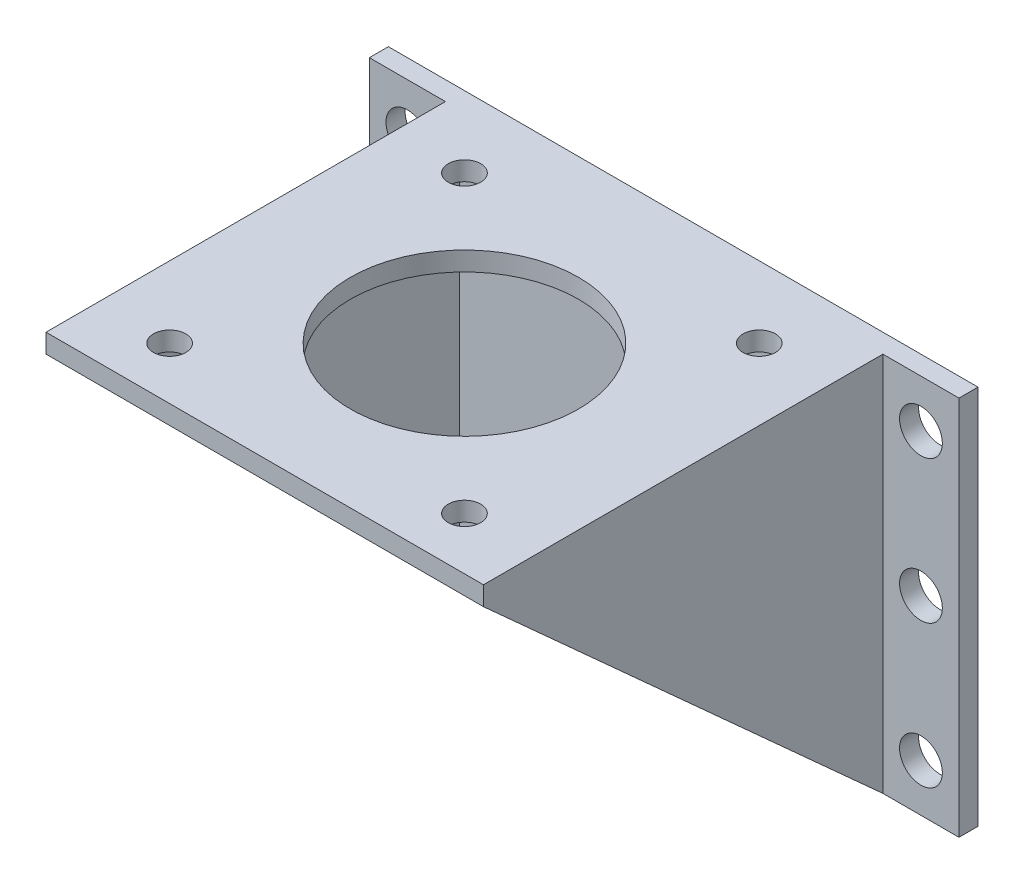
ISO-10303-21;
HEADER;
FILE_DESCRIPTION(('STEP AP214'),'2;1');
FILE_NAME('part.step','',(''),(''),'','','');
FILE_SCHEMA(('AUTOMOTIVE_DESIGN { 1 0 10303 214 1 1 1 1 }'));
ENDSEC;
DATA;
#1=APPLICATION_CONTEXT('core data for automotive mechanical design processes');
#2=APPLICATION_PROTOCOL_DEFINITION('international standard','automotive_design',2000,#1);
#3=PRODUCT_CONTEXT('',#1,'mechanical');
#4=PRODUCT('Part','Part','',(#3));
#5=PRODUCT_RELATED_PRODUCT_CATEGORY('part','',(#4));
#6=PRODUCT_DEFINITION_FORMATION('','',#4);
#7=PRODUCT_DEFINITION_CONTEXT('part definition',#1,'design');
#8=PRODUCT_DEFINITION('design','',#6,#7);
#9=PRODUCT_DEFINITION_SHAPE('','',#8);
#10=(LENGTH_UNIT() NAMED_UNIT(*) SI_UNIT(.MILLI.,.METRE.));
#11=(NAMED_UNIT(*) PLANE_ANGLE_UNIT() SI_UNIT($,.RADIAN.));
#12=(NAMED_UNIT(*) SI_UNIT($,.STERADIAN.) SOLID_ANGLE_UNIT());
#13=UNCERTAINTY_MEASURE_WITH_UNIT(LENGTH_MEASURE(1.E-05),#10,'distance_accuracy_value','');
#14=(GEOMETRIC_REPRESENTATION_CONTEXT(3) GLOBAL_UNCERTAINTY_ASSIGNED_CONTEXT((#13)) GLOBAL_UNIT_ASSIGNED_CONTEXT((#10,
#11,#12)) REPRESENTATION_CONTEXT('',''));
#15=CARTESIAN_POINT('',(0.,0.,0.));
#16=DIRECTION('',(0.,0.,1.));
#17=DIRECTION('',(1.,0.,0.));
#18=AXIS2_PLACEMENT_3D('',#15,#16,#17);
#19=CARTESIAN_POINT('',(0.,0.,2.));
#20=DIRECTION('',(0.,0.,1.));
#21=DIRECTION('',(1.,0.,0.));
#22=AXIS2_PLACEMENT_3D('',#19,#20,#21);
#23=PLANE('',#22);
#24=CARTESIAN_POINT('',(27.,0.,2.));
#25=DIRECTION('',(0.,0.,-1.));
#26=DIRECTION('',(1.,0.,0.));
#27=AXIS2_PLACEMENT_3D('',#24,#25,#26);
#28=CIRCLE('',#27,2.25);
#29=CARTESIAN_POINT('',(29.25,0.,2.));
#30=VERTEX_POINT('',#29);
#31=EDGE_CURVE('E11',#30,#30,#28,.T.);
#32=ORIENTED_EDGE('',*,*,#31,.T.);
#33=EDGE_LOOP('',(#32));
#34=FACE_BOUND('',#33,.T.);
#35=CARTESIAN_POINT('',(27.,-15.,2.));
#36=DIRECTION('',(0.,0.,-1.));
#37=DIRECTION('',(1.,0.,0.));
#38=AXIS2_PLACEMENT_3D('',#35,#36,#37);
#39=CIRCLE('',#38,2.25);
#40=CARTESIAN_POINT('',(29.25,-15.,2.));
#41=VERTEX_POINT('',#40);
#42=EDGE_CURVE('E23',#41,#41,#39,.T.);
#43=ORIENTED_EDGE('',*,*,#42,.T.);
#44=EDGE_LOOP('',(#43));
#45=FACE_BOUND('',#44,.T.);
#46=CARTESIAN_POINT('',(27.,15.,2.));
#47=DIRECTION('',(0.,0.,-1.));
#48=DIRECTION('',(1.,0.,0.));
#49=AXIS2_PLACEMENT_3D('',#46,#47,#48);
#50=CIRCLE('',#49,2.25);
#51=CARTESIAN_POINT('',(29.25,15.,2.));
#52=VERTEX_POINT('',#51);
#53=EDGE_CURVE('E252',#52,#52,#50,.T.);
#54=ORIENTED_EDGE('',*,*,#53,.T.);
#55=EDGE_LOOP('',(#54));
#56=FACE_BOUND('',#55,.T.);
#57=DIRECTION('',(0.,-1.,0.));
#58=VECTOR('',#57,1.);
#59=CARTESIAN_POINT('',(23.,19.,2.));
#60=LINE('',#59,#58);
#61=CARTESIAN_POINT('',(23.,20.,2.));
#62=VERTEX_POINT('',#61);
#63=CARTESIAN_POINT('',(23.,-20.,2.));
#64=VERTEX_POINT('',#63);
#65=EDGE_CURVE('E30',#62,#64,#60,.T.);
#66=ORIENTED_EDGE('',*,*,#65,.T.);
#67=DIRECTION('',(-1.,0.,0.));
#68=VECTOR('',#67,1.);
#69=CARTESIAN_POINT('',(0.,-20.,2.));
#70=LINE('',#69,#68);
#71=CARTESIAN_POINT('',(31.,-20.,2.));
#72=VERTEX_POINT('',#71);
#73=EDGE_CURVE('E34',#72,#64,#70,.T.);
#74=ORIENTED_EDGE('',*,*,#73,.F.);
#75=DIRECTION('',(0.,-1.,0.));
#76=VECTOR('',#75,1.);
#77=CARTESIAN_POINT('',(31.,0.,2.));
#78=LINE('',#77,#76);
#79=CARTESIAN_POINT('',(31.,20.,2.));
#80=VERTEX_POINT('',#79);
#81=EDGE_CURVE('E247',#80,#72,#78,.T.);
#82=ORIENTED_EDGE('',*,*,#81,.F.);
#83=DIRECTION('',(-1.,0.,0.));
#84=VECTOR('',#83,1.);
#85=CARTESIAN_POINT('',(0.,20.,2.));
#86=LINE('',#85,#84);
#87=EDGE_CURVE('E245',#80,#62,#86,.T.);
#88=ORIENTED_EDGE('',*,*,#87,.T.);
#89=EDGE_LOOP('',(#66,#74,#82,#88));
#90=FACE_BOUND('',#89,.T.);
#91=ADVANCED_FACE('F16',(#34,#45,#56,#90),#23,.T.);
#92=CARTESIAN_POINT('',(0.,18.,2.));
#93=DIRECTION('',(0.,-1.,0.));
#94=DIRECTION('',(0.,0.,-1.));
#95=AXIS2_PLACEMENT_3D('',#92,#93,#94);
#96=PLANE('',#95);
#97=CARTESIAN_POINT('',(15.5,18.,7.5));
#98=DIRECTION('',(0.,1.,0.));
#99=DIRECTION('',(0.,0.,1.));
#100=AXIS2_PLACEMENT_3D('',#97,#98,#99);
#101=CIRCLE('',#100,1.7);
#102=CARTESIAN_POINT('',(15.5,18.,9.2));
#103=VERTEX_POINT('',#102);
#104=EDGE_CURVE('E242',#103,#103,#101,.F.);
#105=ORIENTED_EDGE('',*,*,#104,.F.);
#106=EDGE_LOOP('',(#105));
#107=FACE_BOUND('',#106,.T.);
#108=CARTESIAN_POINT('',(15.5,18.,38.5));
#109=DIRECTION('',(0.,1.,0.));
#110=DIRECTION('',(0.,0.,1.));
#111=AXIS2_PLACEMENT_3D('',#108,#109,#110);
#112=CIRCLE('',#111,1.7);
#113=CARTESIAN_POINT('',(15.5,18.,40.2));
#114=VERTEX_POINT('',#113);
#115=EDGE_CURVE('E239',#114,#114,#112,.F.);
#116=ORIENTED_EDGE('',*,*,#115,.F.);
#117=EDGE_LOOP('',(#116));
#118=FACE_BOUND('',#117,.T.);
#119=CARTESIAN_POINT('',(-15.5,18.,7.5));
#120=DIRECTION('',(0.,1.,0.));
#121=DIRECTION('',(0.,0.,1.));
#122=AXIS2_PLACEMENT_3D('',#119,#120,#121);
#123=CIRCLE('',#122,1.7);
#124=CARTESIAN_POINT('',(-15.5,18.,9.2));
#125=VERTEX_POINT('',#124);
#126=EDGE_CURVE('E236',#125,#125,#123,.F.);
#127=ORIENTED_EDGE('',*,*,#126,.F.);
#128=EDGE_LOOP('',(#127));
#129=FACE_BOUND('',#128,.T.);
#130=CARTESIAN_POINT('',(-15.5,18.,38.5));
#131=DIRECTION('',(0.,1.,0.));
#132=DIRECTION('',(0.,0.,1.));
#133=AXIS2_PLACEMENT_3D('',#130,#131,#132);
#134=CIRCLE('',#133,1.7);
#135=CARTESIAN_POINT('',(-15.5,18.,40.2));
#136=VERTEX_POINT('',#135);
#137=EDGE_CURVE('E233',#136,#136,#134,.F.);
#138=ORIENTED_EDGE('',*,*,#137,.F.);
#139=EDGE_LOOP('',(#138));
#140=FACE_BOUND('',#139,.T.);
#141=CARTESIAN_POINT('',(0.,18.,23.));
#142=DIRECTION('',(0.,1.,0.));
#143=DIRECTION('',(0.,0.,1.));
#144=AXIS2_PLACEMENT_3D('',#141,#142,#143);
#145=CIRCLE('',#144,12.);
#146=CARTESIAN_POINT('',(0.,18.,35.));
#147=VERTEX_POINT('',#146);
#148=EDGE_CURVE('E230',#147,#147,#145,.F.);
#149=ORIENTED_EDGE('',*,*,#148,.F.);
#150=EDGE_LOOP('',(#149));
#151=FACE_BOUND('',#150,.T.);
#152=DIRECTION('',(1.,0.,0.));
#153=VECTOR('',#152,1.);
#154=CARTESIAN_POINT('',(0.,18.,2.));
#155=LINE('',#154,#153);
#156=CARTESIAN_POINT('',(-21.5,18.,2.));
#157=VERTEX_POINT('',#156);
#158=CARTESIAN_POINT('',(21.5,18.,2.));
#159=VERTEX_POINT('',#158);
#160=EDGE_CURVE('E228',#157,#159,#155,.T.);
#161=ORIENTED_EDGE('',*,*,#160,.T.);
#162=DIRECTION('',(0.,0.,1.));
#163=VECTOR('',#162,1.);
#164=CARTESIAN_POINT('',(21.5,18.,23.));
#165=LINE('',#164,#163);
#166=CARTESIAN_POINT('',(21.5,18.,44.));
#167=VERTEX_POINT('',#166);
#168=EDGE_CURVE('E226',#159,#167,#165,.T.);
#169=ORIENTED_EDGE('',*,*,#168,.T.);
#170=DIRECTION('',(1.,0.,0.));
#171=VECTOR('',#170,1.);
#172=CARTESIAN_POINT('',(0.,18.,44.));
#173=LINE('',#172,#171);
#174=CARTESIAN_POINT('',(-21.5,18.,44.));
#175=VERTEX_POINT('',#174);
#176=EDGE_CURVE('E114',#175,#167,#173,.T.);
#177=ORIENTED_EDGE('',*,*,#176,.F.);
#178=DIRECTION('',(0.,0.,-1.));
#179=VECTOR('',#178,1.);
#180=CARTESIAN_POINT('',(-21.5,18.,23.));
#181=LINE('',#180,#179);
#182=EDGE_CURVE('E223',#175,#157,#181,.T.);
#183=ORIENTED_EDGE('',*,*,#182,.T.);
#184=EDGE_LOOP('',(#161,#169,#177,#183));
#185=FACE_BOUND('',#184,.T.);
#186=ADVANCED_FACE('F290',(#107,#118,#129,#140,#151,#185),#96,.T.);
#187=CARTESIAN_POINT('',(0.,0.,2.));
#188=DIRECTION('',(0.,0.,1.));
#189=DIRECTION('',(1.,0.,0.));
#190=AXIS2_PLACEMENT_3D('',#187,#188,#189);
#191=PLANE('',#190);
#192=DIRECTION('',(0.,-1.,0.));
#193=VECTOR('',#192,1.);
#194=CARTESIAN_POINT('',(21.5,19.,2.));
#195=LINE('',#194,#193);
#196=CARTESIAN_POINT('',(21.5,-20.,2.));
#197=VERTEX_POINT('',#196);
#198=EDGE_CURVE('E220',#159,#197,#195,.T.);
#199=ORIENTED_EDGE('',*,*,#198,.F.);
#200=ORIENTED_EDGE('',*,*,#160,.F.);
#201=DIRECTION('',(0.,-1.,0.));
#202=VECTOR('',#201,1.);
#203=CARTESIAN_POINT('',(-21.5,19.,2.));
#204=LINE('',#203,#202);
#205=CARTESIAN_POINT('',(-21.5,-20.,2.));
#206=VERTEX_POINT('',#205);
#207=EDGE_CURVE('E218',#157,#206,#204,.T.);
#208=ORIENTED_EDGE('',*,*,#207,.T.);
#209=DIRECTION('',(-1.,0.,0.));
#210=VECTOR('',#209,1.);
#211=CARTESIAN_POINT('',(0.,-20.,2.));
#212=LINE('',#211,#210);
#213=EDGE_CURVE('E215',#197,#206,#212,.T.);
#214=ORIENTED_EDGE('',*,*,#213,.F.);
#215=EDGE_LOOP('',(#199,#200,#208,#214));
#216=FACE_BOUND('',#215,.T.);
#217=ADVANCED_FACE('F296',(#216),#191,.T.);
#218=CARTESIAN_POINT('',(0.,-20.,2.));
#219=DIRECTION('',(0.,-1.,0.));
#220=DIRECTION('',(0.,0.,-1.));
#221=AXIS2_PLACEMENT_3D('',#218,#219,#220);
#222=PLANE('',#221);
#223=ORIENTED_EDGE('',*,*,#73,.T.);
#224=DIRECTION('',(1.,0.,0.));
#225=VECTOR('',#224,1.);
#226=CARTESIAN_POINT('',(21.5,-20.,2.));
#227=LINE('',#226,#225);
#228=EDGE_CURVE('E123',#197,#64,#227,.T.);
#229=ORIENTED_EDGE('',*,*,#228,.F.);
#230=ORIENTED_EDGE('',*,*,#213,.T.);
#231=DIRECTION('',(-1.,0.,0.));
#232=VECTOR('',#231,1.);
#233=CARTESIAN_POINT('',(-21.5,-20.,2.));
#234=LINE('',#233,#232);
#235=CARTESIAN_POINT('',(-23.,-20.,2.));
#236=VERTEX_POINT('',#235);
#237=EDGE_CURVE('E212',#206,#236,#234,.T.);
#238=ORIENTED_EDGE('',*,*,#237,.T.);
#239=DIRECTION('',(-1.,0.,0.));
#240=VECTOR('',#239,1.);
#241=CARTESIAN_POINT('',(0.,-20.,2.));
#242=LINE('',#241,#240);
#243=CARTESIAN_POINT('',(-31.,-20.,2.));
#244=VERTEX_POINT('',#243);
#245=EDGE_CURVE('E210',#236,#244,#242,.T.);
#246=ORIENTED_EDGE('',*,*,#245,.T.);
#247=DIRECTION('',(0.,0.,-1.));
#248=VECTOR('',#247,1.);
#249=CARTESIAN_POINT('',(-31.,-20.,2.));
#250=LINE('',#249,#248);
#251=CARTESIAN_POINT('',(-31.,-20.,0.));
#252=VERTEX_POINT('',#251);
#253=EDGE_CURVE('E208',#244,#252,#250,.T.);
#254=ORIENTED_EDGE('',*,*,#253,.T.);
#255=DIRECTION('',(-1.,0.,0.));
#256=VECTOR('',#255,1.);
#257=CARTESIAN_POINT('',(0.,-20.,0.));
#258=LINE('',#257,#256);
#259=CARTESIAN_POINT('',(31.,-20.,0.));
#260=VERTEX_POINT('',#259);
#261=EDGE_CURVE('E205',#260,#252,#258,.T.);
#262=ORIENTED_EDGE('',*,*,#261,.F.);
#263=DIRECTION('',(0.,0.,-1.));
#264=VECTOR('',#263,1.);
#265=CARTESIAN_POINT('',(31.,-20.,2.));
#266=LINE('',#265,#264);
#267=EDGE_CURVE('E202',#72,#260,#266,.T.);
#268=ORIENTED_EDGE('',*,*,#267,.F.);
#269=EDGE_LOOP('',(#223,#229,#230,#238,#246,#254,#262,#268));
#270=FACE_BOUND('',#269,.T.);
#271=ADVANCED_FACE('F328',(#270),#222,.T.);
#272=CARTESIAN_POINT('',(0.,0.,2.));
#273=DIRECTION('',(0.,0.,1.));
#274=DIRECTION('',(1.,0.,0.));
#275=AXIS2_PLACEMENT_3D('',#272,#273,#274);
#276=PLANE('',#275);
#277=ORIENTED_EDGE('',*,*,#245,.F.);
#278=DIRECTION('',(0.,-1.,0.));
#279=VECTOR('',#278,1.);
#280=CARTESIAN_POINT('',(-23.,19.,2.));
#281=LINE('',#280,#279);
#282=CARTESIAN_POINT('',(-23.,20.,2.));
#283=VERTEX_POINT('',#282);
#284=EDGE_CURVE('E199',#283,#236,#281,.T.);
#285=ORIENTED_EDGE('',*,*,#284,.F.);
#286=DIRECTION('',(-1.,0.,0.));
#287=VECTOR('',#286,1.);
#288=CARTESIAN_POINT('',(0.,20.,2.));
#289=LINE('',#288,#287);
#290=CARTESIAN_POINT('',(-31.,20.,2.));
#291=VERTEX_POINT('',#290);
#292=EDGE_CURVE('E197',#283,#291,#289,.T.);
#293=ORIENTED_EDGE('',*,*,#292,.T.);
#294=DIRECTION('',(0.,-1.,0.));
#295=VECTOR('',#294,1.);
#296=CARTESIAN_POINT('',(-31.,0.,2.));
#297=LINE('',#296,#295);
#298=EDGE_CURVE('E194',#291,#244,#297,.T.);
#299=ORIENTED_EDGE('',*,*,#298,.T.);
#300=EDGE_LOOP('',(#277,#285,#293,#299));
#301=FACE_BOUND('',#300,.T.);
#302=CARTESIAN_POINT('',(-27.,15.,2.));
#303=DIRECTION('',(0.,0.,1.));
#304=DIRECTION('',(1.,0.,0.));
#305=AXIS2_PLACEMENT_3D('',#302,#303,#304);
#306=CIRCLE('',#305,2.25);
#307=CARTESIAN_POINT('',(-24.75,15.,2.));
#308=VERTEX_POINT('',#307);
#309=EDGE_CURVE('E191',#308,#308,#306,.T.);
#310=ORIENTED_EDGE('',*,*,#309,.F.);
#311=EDGE_LOOP('',(#310));
#312=FACE_BOUND('',#311,.T.);
#313=CARTESIAN_POINT('',(-27.,0.,2.));
#314=DIRECTION('',(0.,0.,1.));
#315=DIRECTION('',(1.,0.,0.));
#316=AXIS2_PLACEMENT_3D('',#313,#314,#315);
#317=CIRCLE('',#316,2.25);
#318=CARTESIAN_POINT('',(-24.75,0.,2.));
#319=VERTEX_POINT('',#318);
#320=EDGE_CURVE('E188',#319,#319,#317,.T.);
#321=ORIENTED_EDGE('',*,*,#320,.F.);
#322=EDGE_LOOP('',(#321));
#323=FACE_BOUND('',#322,.T.);
#324=CARTESIAN_POINT('',(-27.,-15.,2.));
#325=DIRECTION('',(0.,0.,1.));
#326=DIRECTION('',(1.,0.,0.));
#327=AXIS2_PLACEMENT_3D('',#324,#325,#326);
#328=CIRCLE('',#327,2.25);
#329=CARTESIAN_POINT('',(-24.75,-15.,2.));
#330=VERTEX_POINT('',#329);
#331=EDGE_CURVE('E185',#330,#330,#328,.T.);
#332=ORIENTED_EDGE('',*,*,#331,.F.);
#333=EDGE_LOOP('',(#332));
#334=FACE_BOUND('',#333,.T.);
#335=ADVANCED_FACE('F324',(#301,#312,#323,#334),#276,.T.);
#336=CARTESIAN_POINT('',(31.,0.,2.));
#337=DIRECTION('',(1.,0.,0.));
#338=DIRECTION('',(0.,0.,-1.));
#339=AXIS2_PLACEMENT_3D('',#336,#337,#338);
#340=PLANE('',#339);
#341=DIRECTION('',(0.,-1.,0.));
#342=VECTOR('',#341,1.);
#343=CARTESIAN_POINT('',(31.,0.,0.));
#344=LINE('',#343,#342);
#345=CARTESIAN_POINT('',(31.,20.,0.));
#346=VERTEX_POINT('',#345);
#347=EDGE_CURVE('E182',#346,#260,#344,.T.);
#348=ORIENTED_EDGE('',*,*,#347,.F.);
#349=DIRECTION('',(0.,0.,-1.));
#350=VECTOR('',#349,1.);
#351=CARTESIAN_POINT('',(31.,20.,2.));
#352=LINE('',#351,#350);
#353=EDGE_CURVE('E179',#80,#346,#352,.T.);
#354=ORIENTED_EDGE('',*,*,#353,.F.);
#355=ORIENTED_EDGE('',*,*,#81,.T.);
#356=ORIENTED_EDGE('',*,*,#267,.T.);
#357=EDGE_LOOP('',(#348,#354,#355,#356));
#358=FACE_BOUND('',#357,.T.);
#359=ADVANCED_FACE('F320',(#358),#340,.T.);
#360=CARTESIAN_POINT('',(0.,20.,2.));
#361=DIRECTION('',(0.,-1.,0.));
#362=DIRECTION('',(0.,0.,-1.));
#363=AXIS2_PLACEMENT_3D('',#360,#361,#362);
#364=PLANE('',#363);
#365=CARTESIAN_POINT('',(15.5,20.,7.5));
#366=DIRECTION('',(0.,-1.,0.));
#367=DIRECTION('',(0.,0.,-1.));
#368=AXIS2_PLACEMENT_3D('',#365,#366,#367);
#369=CIRCLE('',#368,1.7);
#370=CARTESIAN_POINT('',(15.5,20.,5.8));
#371=VERTEX_POINT('',#370);
#372=EDGE_CURVE('E176',#371,#371,#369,.T.);
#373=ORIENTED_EDGE('',*,*,#372,.T.);
#374=EDGE_LOOP('',(#373));
#375=FACE_BOUND('',#374,.T.);
#376=CARTESIAN_POINT('',(15.5,20.,38.5));
#377=DIRECTION('',(0.,-1.,0.));
#378=DIRECTION('',(0.,0.,-1.));
#379=AXIS2_PLACEMENT_3D('',#376,#377,#378);
#380=CIRCLE('',#379,1.7);
#381=CARTESIAN_POINT('',(15.5,20.,36.8));
#382=VERTEX_POINT('',#381);
#383=EDGE_CURVE('E173',#382,#382,#380,.T.);
#384=ORIENTED_EDGE('',*,*,#383,.T.);
#385=EDGE_LOOP('',(#384));
#386=FACE_BOUND('',#385,.T.);
#387=CARTESIAN_POINT('',(-15.5,20.,7.5));
#388=DIRECTION('',(0.,-1.,0.));
#389=DIRECTION('',(0.,0.,-1.));
#390=AXIS2_PLACEMENT_3D('',#387,#388,#389);
#391=CIRCLE('',#390,1.7);
#392=CARTESIAN_POINT('',(-15.5,20.,5.8));
#393=VERTEX_POINT('',#392);
#394=EDGE_CURVE('E170',#393,#393,#391,.T.);
#395=ORIENTED_EDGE('',*,*,#394,.T.);
#396=EDGE_LOOP('',(#395));
#397=FACE_BOUND('',#396,.T.);
#398=CARTESIAN_POINT('',(-15.5,20.,38.5));
#399=DIRECTION('',(0.,-1.,0.));
#400=DIRECTION('',(0.,0.,-1.));
#401=AXIS2_PLACEMENT_3D('',#398,#399,#400);
#402=CIRCLE('',#401,1.7);
#403=CARTESIAN_POINT('',(-15.5,20.,36.8));
#404=VERTEX_POINT('',#403);
#405=EDGE_CURVE('E167',#404,#404,#402,.T.);
#406=ORIENTED_EDGE('',*,*,#405,.T.);
#407=EDGE_LOOP('',(#406));
#408=FACE_BOUND('',#407,.T.);
#409=CARTESIAN_POINT('',(0.,20.,23.));
#410=DIRECTION('',(0.,-1.,0.));
#411=DIRECTION('',(0.,0.,-1.));
#412=AXIS2_PLACEMENT_3D('',#409,#410,#411);
#413=CIRCLE('',#412,12.);
#414=CARTESIAN_POINT('',(0.,20.,11.));
#415=VERTEX_POINT('',#414);
#416=EDGE_CURVE('E164',#415,#415,#413,.T.);
#417=ORIENTED_EDGE('',*,*,#416,.T.);
#418=EDGE_LOOP('',(#417));
#419=FACE_BOUND('',#418,.T.);
#420=DIRECTION('',(-1.,0.,0.));
#421=VECTOR('',#420,1.);
#422=CARTESIAN_POINT('',(0.,20.,0.));
#423=LINE('',#422,#421);
#424=CARTESIAN_POINT('',(-31.,20.,0.));
#425=VERTEX_POINT('',#424);
#426=EDGE_CURVE('E162',#346,#425,#423,.T.);
#427=ORIENTED_EDGE('',*,*,#426,.T.);
#428=DIRECTION('',(0.,0.,-1.));
#429=VECTOR('',#428,1.);
#430=CARTESIAN_POINT('',(-31.,20.,2.));
#431=LINE('',#430,#429);
#432=EDGE_CURVE('E159',#291,#425,#431,.T.);
#433=ORIENTED_EDGE('',*,*,#432,.F.);
#434=ORIENTED_EDGE('',*,*,#292,.F.);
#435=DIRECTION('',(0.,0.,-1.));
#436=VECTOR('',#435,1.);
#437=CARTESIAN_POINT('',(-23.,20.,44.));
#438=LINE('',#437,#436);
#439=CARTESIAN_POINT('',(-23.,20.,44.));
#440=VERTEX_POINT('',#439);
#441=EDGE_CURVE('E156',#440,#283,#438,.T.);
#442=ORIENTED_EDGE('',*,*,#441,.F.);
#443=DIRECTION('',(-1.,0.,0.));
#444=VECTOR('',#443,1.);
#445=CARTESIAN_POINT('',(0.,20.,44.));
#446=LINE('',#445,#444);
#447=CARTESIAN_POINT('',(23.,20.,44.));
#448=VERTEX_POINT('',#447);
#449=EDGE_CURVE('E154',#448,#440,#446,.T.);
#450=ORIENTED_EDGE('',*,*,#449,.F.);
#451=DIRECTION('',(0.,0.,-1.));
#452=VECTOR('',#451,1.);
#453=CARTESIAN_POINT('',(23.,20.,44.));
#454=LINE('',#453,#452);
#455=EDGE_CURVE('E104',#448,#62,#454,.T.);
#456=ORIENTED_EDGE('',*,*,#455,.T.);
#457=ORIENTED_EDGE('',*,*,#87,.F.);
#458=ORIENTED_EDGE('',*,*,#353,.T.);
#459=EDGE_LOOP('',(#427,#433,#434,#442,#450,#456,#457,#458));
#460=FACE_BOUND('',#459,.T.);
#461=ADVANCED_FACE('F316',(#375,#386,#397,#408,#419,#460),#364,.F.);
#462=CARTESIAN_POINT('',(-31.,0.,2.));
#463=DIRECTION('',(1.,0.,0.));
#464=DIRECTION('',(0.,0.,-1.));
#465=AXIS2_PLACEMENT_3D('',#462,#463,#464);
#466=PLANE('',#465);
#467=DIRECTION('',(0.,-1.,0.));
#468=VECTOR('',#467,1.);
#469=CARTESIAN_POINT('',(-31.,0.,0.));
#470=LINE('',#469,#468);
#471=EDGE_CURVE('E150',#425,#252,#470,.T.);
#472=ORIENTED_EDGE('',*,*,#471,.T.);
#473=ORIENTED_EDGE('',*,*,#253,.F.);
#474=ORIENTED_EDGE('',*,*,#298,.F.);
#475=ORIENTED_EDGE('',*,*,#432,.T.);
#476=EDGE_LOOP('',(#472,#473,#474,#475));
#477=FACE_BOUND('',#476,.T.);
#478=ADVANCED_FACE('F263',(#477),#466,.F.);
#479=CARTESIAN_POINT('',(27.,-15.,2.));
#480=DIRECTION('',(0.,0.,-1.));
#481=DIRECTION('',(-1.,0.,0.));
#482=AXIS2_PLACEMENT_3D('',#479,#480,#481);
#483=CYLINDRICAL_SURFACE('',#482,2.25);
#484=ORIENTED_EDGE('',*,*,#42,.F.);
#485=EDGE_LOOP('',(#484));
#486=FACE_BOUND('',#485,.T.);
#487=CARTESIAN_POINT('',(27.,-15.,0.));
#488=DIRECTION('',(0.,0.,-1.));
#489=DIRECTION('',(1.,0.,0.));
#490=AXIS2_PLACEMENT_3D('',#487,#488,#489);
#491=CIRCLE('',#490,2.25);
#492=CARTESIAN_POINT('',(29.25,-15.,0.));
#493=VERTEX_POINT('',#492);
#494=EDGE_CURVE('E147',#493,#493,#491,.T.);
#495=ORIENTED_EDGE('',*,*,#494,.T.);
#496=EDGE_LOOP('',(#495));
#497=FACE_BOUND('',#496,.T.);
#498=ADVANCED_FACE('F259',(#486,#497),#483,.F.);
#499=CARTESIAN_POINT('',(27.,0.,2.));
#500=DIRECTION('',(0.,0.,-1.));
#501=DIRECTION('',(-1.,0.,0.));
#502=AXIS2_PLACEMENT_3D('',#499,#500,#501);
#503=CYLINDRICAL_SURFACE('',#502,2.25);
#504=ORIENTED_EDGE('',*,*,#31,.F.);
#505=EDGE_LOOP('',(#504));
#506=FACE_BOUND('',#505,.T.);
#507=CARTESIAN_POINT('',(27.,0.,0.));
#508=DIRECTION('',(0.,0.,-1.));
#509=DIRECTION('',(1.,0.,0.));
#510=AXIS2_PLACEMENT_3D('',#507,#508,#509);
#511=CIRCLE('',#510,2.25);
#512=CARTESIAN_POINT('',(29.25,0.,0.));
#513=VERTEX_POINT('',#512);
#514=EDGE_CURVE('E144',#513,#513,#511,.T.);
#515=ORIENTED_EDGE('',*,*,#514,.T.);
#516=EDGE_LOOP('',(#515));
#517=FACE_BOUND('',#516,.T.);
#518=ADVANCED_FACE('F262',(#506,#517),#503,.F.);
#519=CARTESIAN_POINT('',(-27.,-15.,2.));
#520=DIRECTION('',(0.,0.,-1.));
#521=DIRECTION('',(-1.,0.,0.));
#522=AXIS2_PLACEMENT_3D('',#519,#520,#521);
#523=CYLINDRICAL_SURFACE('',#522,2.25);
#524=ORIENTED_EDGE('',*,*,#331,.T.);
#525=EDGE_LOOP('',(#524));
#526=FACE_BOUND('',#525,.T.);
#527=CARTESIAN_POINT('',(-27.,-15.,0.));
#528=DIRECTION('',(0.,0.,1.));
#529=DIRECTION('',(1.,0.,0.));
#530=AXIS2_PLACEMENT_3D('',#527,#528,#529);
#531=CIRCLE('',#530,2.25);
#532=CARTESIAN_POINT('',(-24.75,-15.,0.));
#533=VERTEX_POINT('',#532);
#534=EDGE_CURVE('E141',#533,#533,#531,.T.);
#535=ORIENTED_EDGE('',*,*,#534,.F.);
#536=EDGE_LOOP('',(#535));
#537=FACE_BOUND('',#536,.T.);
#538=ADVANCED_FACE('F302',(#526,#537),#523,.F.);
#539=CARTESIAN_POINT('',(-27.,0.,2.));
#540=DIRECTION('',(0.,0.,-1.));
#541=DIRECTION('',(-1.,0.,0.));
#542=AXIS2_PLACEMENT_3D('',#539,#540,#541);
#543=CYLINDRICAL_SURFACE('',#542,2.25);
#544=ORIENTED_EDGE('',*,*,#320,.T.);
#545=EDGE_LOOP('',(#544));
#546=FACE_BOUND('',#545,.T.);
#547=CARTESIAN_POINT('',(-27.,0.,0.));
#548=DIRECTION('',(0.,0.,1.));
#549=DIRECTION('',(1.,0.,0.));
#550=AXIS2_PLACEMENT_3D('',#547,#548,#549);
#551=CIRCLE('',#550,2.25);
#552=CARTESIAN_POINT('',(-24.75,0.,0.));
#553=VERTEX_POINT('',#552);
#554=EDGE_CURVE('E138',#553,#553,#551,.T.);
#555=ORIENTED_EDGE('',*,*,#554,.F.);
#556=EDGE_LOOP('',(#555));
#557=FACE_BOUND('',#556,.T.);
#558=ADVANCED_FACE('F285',(#546,#557),#543,.F.);
#559=CARTESIAN_POINT('',(-27.,15.,2.));
#560=DIRECTION('',(0.,0.,-1.));
#561=DIRECTION('',(-1.,0.,0.));
#562=AXIS2_PLACEMENT_3D('',#559,#560,#561);
#563=CYLINDRICAL_SURFACE('',#562,2.25);
#564=ORIENTED_EDGE('',*,*,#309,.T.);
#565=EDGE_LOOP('',(#564));
#566=FACE_BOUND('',#565,.T.);
#567=CARTESIAN_POINT('',(-27.,15.,0.));
#568=DIRECTION('',(0.,0.,1.));
#569=DIRECTION('',(1.,0.,0.));
#570=AXIS2_PLACEMENT_3D('',#567,#568,#569);
#571=CIRCLE('',#570,2.25);
#572=CARTESIAN_POINT('',(-24.75,15.,0.));
#573=VERTEX_POINT('',#572);
#574=EDGE_CURVE('E135',#573,#573,#571,.T.);
#575=ORIENTED_EDGE('',*,*,#574,.F.);
#576=EDGE_LOOP('',(#575));
#577=FACE_BOUND('',#576,.T.);
#578=ADVANCED_FACE('F277',(#566,#577),#563,.F.);
#579=CARTESIAN_POINT('',(27.,15.,2.));
#580=DIRECTION('',(0.,0.,-1.));
#581=DIRECTION('',(-1.,0.,0.));
#582=AXIS2_PLACEMENT_3D('',#579,#580,#581);
#583=CYLINDRICAL_SURFACE('',#582,2.25);
#584=ORIENTED_EDGE('',*,*,#53,.F.);
#585=EDGE_LOOP('',(#584));
#586=FACE_BOUND('',#585,.T.);
#587=CARTESIAN_POINT('',(27.,15.,0.));
#588=DIRECTION('',(0.,0.,-1.));
#589=DIRECTION('',(1.,0.,0.));
#590=AXIS2_PLACEMENT_3D('',#587,#588,#589);
#591=CIRCLE('',#590,2.25);
#592=CARTESIAN_POINT('',(29.25,15.,0.));
#593=VERTEX_POINT('',#592);
#594=EDGE_CURVE('E132',#593,#593,#591,.T.);
#595=ORIENTED_EDGE('',*,*,#594,.T.);
#596=EDGE_LOOP('',(#595));
#597=FACE_BOUND('',#596,.T.);
#598=ADVANCED_FACE('F271',(#586,#597),#583,.F.);
#599=CARTESIAN_POINT('',(0.,0.,0.));
#600=DIRECTION('',(0.,0.,1.));
#601=DIRECTION('',(1.,0.,0.));
#602=AXIS2_PLACEMENT_3D('',#599,#600,#601);
#603=PLANE('',#602);
#604=ORIENTED_EDGE('',*,*,#347,.T.);
#605=ORIENTED_EDGE('',*,*,#261,.T.);
#606=ORIENTED_EDGE('',*,*,#471,.F.);
#607=ORIENTED_EDGE('',*,*,#426,.F.);
#608=EDGE_LOOP('',(#604,#605,#606,#607));
#609=FACE_BOUND('',#608,.T.);
#610=ORIENTED_EDGE('',*,*,#574,.T.);
#611=EDGE_LOOP('',(#610));
#612=FACE_BOUND('',#611,.T.);
#613=ORIENTED_EDGE('',*,*,#554,.T.);
#614=EDGE_LOOP('',(#613));
#615=FACE_BOUND('',#614,.T.);
#616=ORIENTED_EDGE('',*,*,#534,.T.);
#617=EDGE_LOOP('',(#616));
#618=FACE_BOUND('',#617,.T.);
#619=ORIENTED_EDGE('',*,*,#514,.F.);
#620=EDGE_LOOP('',(#619));
#621=FACE_BOUND('',#620,.T.);
#622=ORIENTED_EDGE('',*,*,#494,.F.);
#623=EDGE_LOOP('',(#622));
#624=FACE_BOUND('',#623,.T.);
#625=ORIENTED_EDGE('',*,*,#594,.F.);
#626=EDGE_LOOP('',(#625));
#627=FACE_BOUND('',#626,.T.);
#628=ADVANCED_FACE('F267',(#609,#612,#615,#618,#621,#624,#627),#603,.F.);
#629=CARTESIAN_POINT('',(-23.,19.,44.));
#630=DIRECTION('',(1.,0.,0.));
#631=DIRECTION('',(0.,0.,-1.));
#632=AXIS2_PLACEMENT_3D('',#629,#630,#631);
#633=PLANE('',#632);
#634=ORIENTED_EDGE('',*,*,#284,.T.);
#635=DIRECTION('',(0.,-0.670913323969126,-0.741535779123771));
#636=VECTOR('',#635,1.);
#637=CARTESIAN_POINT('',(-23.,-1.,23.));
#638=LINE('',#637,#636);
#639=CARTESIAN_POINT('',(-23.,18.,44.));
#640=VERTEX_POINT('',#639);
#641=EDGE_CURVE('E129',#640,#236,#638,.T.);
#642=ORIENTED_EDGE('',*,*,#641,.F.);
#643=DIRECTION('',(0.,-1.,0.));
#644=VECTOR('',#643,1.);
#645=CARTESIAN_POINT('',(-23.,19.,44.));
#646=LINE('',#645,#644);
#647=EDGE_CURVE('E107',#440,#640,#646,.T.);
#648=ORIENTED_EDGE('',*,*,#647,.F.);
#649=ORIENTED_EDGE('',*,*,#441,.T.);
#650=EDGE_LOOP('',(#634,#642,#648,#649));
#651=FACE_BOUND('',#650,.T.);
#652=ADVANCED_FACE('F270',(#651),#633,.F.);
#653=CARTESIAN_POINT('',(23.,19.,44.));
#654=DIRECTION('',(1.,0.,0.));
#655=DIRECTION('',(0.,0.,-1.));
#656=AXIS2_PLACEMENT_3D('',#653,#654,#655);
#657=PLANE('',#656);
#658=DIRECTION('',(0.,-1.,0.));
#659=VECTOR('',#658,1.);
#660=CARTESIAN_POINT('',(23.,19.,44.));
#661=LINE('',#660,#659);
#662=CARTESIAN_POINT('',(23.,18.,44.));
#663=VERTEX_POINT('',#662);
#664=EDGE_CURVE('E97',#448,#663,#661,.T.);
#665=ORIENTED_EDGE('',*,*,#664,.T.);
#666=DIRECTION('',(0.,-0.670913323969126,-0.741535779123771));
#667=VECTOR('',#666,1.);
#668=CARTESIAN_POINT('',(23.,-1.,23.));
#669=LINE('',#668,#667);
#670=EDGE_CURVE('E101',#663,#64,#669,.T.);
#671=ORIENTED_EDGE('',*,*,#670,.T.);
#672=ORIENTED_EDGE('',*,*,#65,.F.);
#673=ORIENTED_EDGE('',*,*,#455,.F.);
#674=EDGE_LOOP('',(#665,#671,#672,#673));
#675=FACE_BOUND('',#674,.T.);
#676=ADVANCED_FACE('F99',(#675),#657,.T.);
#677=CARTESIAN_POINT('',(0.,0.,44.));
#678=DIRECTION('',(0.,0.,1.));
#679=DIRECTION('',(1.,0.,0.));
#680=AXIS2_PLACEMENT_3D('',#677,#678,#679);
#681=PLANE('',#680);
#682=ORIENTED_EDGE('',*,*,#449,.T.);
#683=ORIENTED_EDGE('',*,*,#647,.T.);
#684=DIRECTION('',(1.,0.,0.));
#685=VECTOR('',#684,1.);
#686=CARTESIAN_POINT('',(0.,18.,44.));
#687=LINE('',#686,#685);
#688=EDGE_CURVE('E118',#640,#175,#687,.T.);
#689=ORIENTED_EDGE('',*,*,#688,.T.);
#690=ORIENTED_EDGE('',*,*,#176,.T.);
#691=DIRECTION('',(1.,0.,0.));
#692=VECTOR('',#691,1.);
#693=CARTESIAN_POINT('',(21.5,18.,44.));
#694=LINE('',#693,#692);
#695=EDGE_CURVE('E111',#167,#663,#694,.T.);
#696=ORIENTED_EDGE('',*,*,#695,.T.);
#697=ORIENTED_EDGE('',*,*,#664,.F.);
#698=EDGE_LOOP('',(#682,#683,#689,#690,#696,#697));
#699=FACE_BOUND('',#698,.T.);
#700=ADVANCED_FACE('F112',(#699),#681,.T.);
#701=CARTESIAN_POINT('',(0.,43.4,23.));
#702=DIRECTION('',(0.,-1.,0.));
#703=DIRECTION('',(0.,0.,-1.));
#704=AXIS2_PLACEMENT_3D('',#701,#702,#703);
#705=CYLINDRICAL_SURFACE('',#704,12.);
#706=ORIENTED_EDGE('',*,*,#148,.T.);
#707=EDGE_LOOP('',(#706));
#708=FACE_BOUND('',#707,.T.);
#709=ORIENTED_EDGE('',*,*,#416,.F.);
#710=EDGE_LOOP('',(#709));
#711=FACE_BOUND('',#710,.T.);
#712=ADVANCED_FACE('F457',(#708,#711),#705,.F.);
#713=CARTESIAN_POINT('',(-15.5,43.4,38.5));
#714=DIRECTION('',(0.,-1.,0.));
#715=DIRECTION('',(0.,0.,-1.));
#716=AXIS2_PLACEMENT_3D('',#713,#714,#715);
#717=CYLINDRICAL_SURFACE('',#716,1.7);
#718=ORIENTED_EDGE('',*,*,#137,.T.);
#719=EDGE_LOOP('',(#718));
#720=FACE_BOUND('',#719,.T.);
#721=ORIENTED_EDGE('',*,*,#405,.F.);
#722=EDGE_LOOP('',(#721));
#723=FACE_BOUND('',#722,.T.);
#724=ADVANCED_FACE('F468',(#720,#723),#717,.F.);
#725=CARTESIAN_POINT('',(-15.5,43.4,7.5));
#726=DIRECTION('',(0.,-1.,0.));
#727=DIRECTION('',(0.,0.,-1.));
#728=AXIS2_PLACEMENT_3D('',#725,#726,#727);
#729=CYLINDRICAL_SURFACE('',#728,1.7);
#730=ORIENTED_EDGE('',*,*,#126,.T.);
#731=EDGE_LOOP('',(#730));
#732=FACE_BOUND('',#731,.T.);
#733=ORIENTED_EDGE('',*,*,#394,.F.);
#734=EDGE_LOOP('',(#733));
#735=FACE_BOUND('',#734,.T.);
#736=ADVANCED_FACE('F479',(#732,#735),#729,.F.);
#737=CARTESIAN_POINT('',(15.5,43.4,38.5));
#738=DIRECTION('',(0.,-1.,0.));
#739=DIRECTION('',(0.,0.,-1.));
#740=AXIS2_PLACEMENT_3D('',#737,#738,#739);
#741=CYLINDRICAL_SURFACE('',#740,1.7);
#742=ORIENTED_EDGE('',*,*,#115,.T.);
#743=EDGE_LOOP('',(#742));
#744=FACE_BOUND('',#743,.T.);
#745=ORIENTED_EDGE('',*,*,#383,.F.);
#746=EDGE_LOOP('',(#745));
#747=FACE_BOUND('',#746,.T.);
#748=ADVANCED_FACE('F488',(#744,#747),#741,.F.);
#749=CARTESIAN_POINT('',(15.5,43.4,7.5));
#750=DIRECTION('',(0.,-1.,0.));
#751=DIRECTION('',(0.,0.,-1.));
#752=AXIS2_PLACEMENT_3D('',#749,#750,#751);
#753=CYLINDRICAL_SURFACE('',#752,1.7);
#754=ORIENTED_EDGE('',*,*,#104,.T.);
#755=EDGE_LOOP('',(#754));
#756=FACE_BOUND('',#755,.T.);
#757=ORIENTED_EDGE('',*,*,#372,.F.);
#758=EDGE_LOOP('',(#757));
#759=FACE_BOUND('',#758,.T.);
#760=ADVANCED_FACE('F391',(#756,#759),#753,.F.);
#761=CARTESIAN_POINT('',(-21.5,-1.,23.));
#762=DIRECTION('',(0.,0.741535779123771,-0.670913323969126));
#763=DIRECTION('',(0.,0.670913323969126,0.741535779123771));
#764=AXIS2_PLACEMENT_3D('',#761,#762,#763);
#765=PLANE('',#764);
#766=ORIENTED_EDGE('',*,*,#641,.T.);
#767=ORIENTED_EDGE('',*,*,#237,.F.);
#768=DIRECTION('',(0.,-0.670913323969126,-0.741535779123771));
#769=VECTOR('',#768,1.);
#770=CARTESIAN_POINT('',(-21.5,-1.,23.));
#771=LINE('',#770,#769);
#772=EDGE_CURVE('E119',#175,#206,#771,.T.);
#773=ORIENTED_EDGE('',*,*,#772,.F.);
#774=ORIENTED_EDGE('',*,*,#688,.F.);
#775=EDGE_LOOP('',(#766,#767,#773,#774));
#776=FACE_BOUND('',#775,.T.);
#777=ADVANCED_FACE('F353',(#776),#765,.F.);
#778=CARTESIAN_POINT('',(-21.5,0.,23.));
#779=DIRECTION('',(-1.,0.,0.));
#780=DIRECTION('',(0.,-1.,0.));
#781=AXIS2_PLACEMENT_3D('',#778,#779,#780);
#782=PLANE('',#781);
#783=ORIENTED_EDGE('',*,*,#772,.T.);
#784=ORIENTED_EDGE('',*,*,#207,.F.);
#785=ORIENTED_EDGE('',*,*,#182,.F.);
#786=EDGE_LOOP('',(#783,#784,#785));
#787=FACE_BOUND('',#786,.T.);
#788=ADVANCED_FACE('F348',(#787),#782,.F.);
#789=CARTESIAN_POINT('',(21.5,-1.,23.));
#790=DIRECTION('',(0.,-0.741535779123771,0.670913323969126));
#791=DIRECTION('',(0.,-0.670913323969126,-0.741535779123771));
#792=AXIS2_PLACEMENT_3D('',#789,#790,#791);
#793=PLANE('',#792);
#794=ORIENTED_EDGE('',*,*,#670,.F.);
#795=ORIENTED_EDGE('',*,*,#695,.F.);
#796=DIRECTION('',(0.,-0.670913323969126,-0.741535779123771));
#797=VECTOR('',#796,1.);
#798=CARTESIAN_POINT('',(21.5,-1.,23.));
#799=LINE('',#798,#797);
#800=EDGE_CURVE('E343',#167,#197,#799,.T.);
#801=ORIENTED_EDGE('',*,*,#800,.T.);
#802=ORIENTED_EDGE('',*,*,#228,.T.);
#803=EDGE_LOOP('',(#794,#795,#801,#802));
#804=FACE_BOUND('',#803,.T.);
#805=ADVANCED_FACE('F121',(#804),#793,.T.);
#806=CARTESIAN_POINT('',(21.5,0.,23.));
#807=DIRECTION('',(1.,0.,0.));
#808=DIRECTION('',(0.,1.,0.));
#809=AXIS2_PLACEMENT_3D('',#806,#807,#808);
#810=PLANE('',#809);
#811=ORIENTED_EDGE('',*,*,#198,.T.);
#812=ORIENTED_EDGE('',*,*,#800,.F.);
#813=ORIENTED_EDGE('',*,*,#168,.F.);
#814=EDGE_LOOP('',(#811,#812,#813));
#815=FACE_BOUND('',#814,.T.);
#816=ADVANCED_FACE('F342',(#815),#810,.F.);
#817=CLOSED_SHELL('',(#91,#186,#217,#271,#335,#359,#461,#478,#498,#518,#538,#558,#578,#598,#628,
#652,#676,#700,#712,#724,#736,#748,#760,#777,#788,#805,#816));
#818=MANIFOLD_SOLID_BREP('B1',#817);
#819=ADVANCED_BREP_SHAPE_REPRESENTATION('',(#18,#818),#14);
#820=SHAPE_DEFINITION_REPRESENTATION(#9,#819);
ENDSEC;
END-ISO-10303-21;
